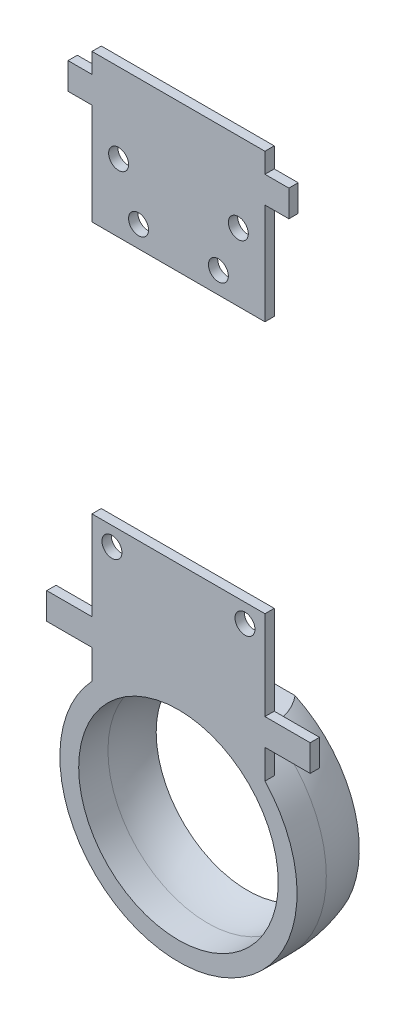
ISO-10303-21;
HEADER;
FILE_DESCRIPTION(('STEP AP214'),'2;1');
FILE_NAME('part.step','',(''),(''),'','','');
FILE_SCHEMA(('AUTOMOTIVE_DESIGN { 1 0 10303 214 1 1 1 1 }'));
ENDSEC;
DATA;
#1=APPLICATION_CONTEXT('core data for automotive mechanical design processes');
#2=APPLICATION_PROTOCOL_DEFINITION('international standard','automotive_design',2000,#1);
#3=PRODUCT_CONTEXT('',#1,'mechanical');
#4=PRODUCT('Part','Part','',(#3));
#5=PRODUCT_RELATED_PRODUCT_CATEGORY('part','',(#4));
#6=PRODUCT_DEFINITION_FORMATION('','',#4);
#7=PRODUCT_DEFINITION_CONTEXT('part definition',#1,'design');
#8=PRODUCT_DEFINITION('design','',#6,#7);
#9=PRODUCT_DEFINITION_SHAPE('','',#8);
#10=(LENGTH_UNIT() NAMED_UNIT(*) SI_UNIT(.MILLI.,.METRE.));
#11=(NAMED_UNIT(*) PLANE_ANGLE_UNIT() SI_UNIT($,.RADIAN.));
#12=(NAMED_UNIT(*) SI_UNIT($,.STERADIAN.) SOLID_ANGLE_UNIT());
#13=UNCERTAINTY_MEASURE_WITH_UNIT(LENGTH_MEASURE(1.E-05),#10,'distance_accuracy_value','');
#14=(GEOMETRIC_REPRESENTATION_CONTEXT(3) GLOBAL_UNCERTAINTY_ASSIGNED_CONTEXT((#13)) GLOBAL_UNIT_ASSIGNED_CONTEXT((#10,
#11,#12)) REPRESENTATION_CONTEXT('',''));
#15=CARTESIAN_POINT('',(0.,0.,0.));
#16=DIRECTION('',(0.,0.,1.));
#17=DIRECTION('',(1.,0.,0.));
#18=AXIS2_PLACEMENT_3D('',#15,#16,#17);
#19=CARTESIAN_POINT('',(0.,0.,0.));
#20=DIRECTION('',(0.,0.,1.));
#21=DIRECTION('',(1.,0.,0.));
#22=AXIS2_PLACEMENT_3D('',#19,#20,#21);
#23=PLANE('',#22);
#24=DIRECTION('',(0.,1.,0.));
#25=VECTOR('',#24,1.);
#26=CARTESIAN_POINT('',(-32.5,0.,0.));
#27=LINE('',#26,#25);
#28=CARTESIAN_POINT('',(-32.5,48.5,0.));
#29=VERTEX_POINT('',#28);
#30=CARTESIAN_POINT('',(-32.5,81.9777538919084,0.));
#31=VERTEX_POINT('',#30);
#32=EDGE_CURVE('E271',#29,#31,#27,.T.);
#33=ORIENTED_EDGE('',*,*,#32,.T.);
#34=DIRECTION('',(1.,0.,0.));
#35=VECTOR('',#34,1.);
#36=CARTESIAN_POINT('',(0.,81.9777538919084,0.));
#37=LINE('',#36,#35);
#38=CARTESIAN_POINT('',(32.5,81.9777538919084,0.));
#39=VERTEX_POINT('',#38);
#40=EDGE_CURVE('E76',#31,#39,#37,.T.);
#41=ORIENTED_EDGE('',*,*,#40,.T.);
#42=DIRECTION('',(0.,1.,0.));
#43=VECTOR('',#42,1.);
#44=CARTESIAN_POINT('',(32.5,0.,0.));
#45=LINE('',#44,#43);
#46=CARTESIAN_POINT('',(32.5,48.5000000000001,0.));
#47=VERTEX_POINT('',#46);
#48=EDGE_CURVE('E173',#47,#39,#45,.T.);
#49=ORIENTED_EDGE('',*,*,#48,.F.);
#50=DIRECTION('',(1.,0.,0.));
#51=VECTOR('',#50,1.);
#52=CARTESIAN_POINT('',(1.58370049100942E-13,48.5000000000002,0.));
#53=LINE('',#52,#51);
#54=CARTESIAN_POINT('',(49.4999999999999,48.5000000000001,0.));
#55=VERTEX_POINT('',#54);
#56=EDGE_CURVE('E246',#47,#55,#53,.T.);
#57=ORIENTED_EDGE('',*,*,#56,.T.);
#58=DIRECTION('',(0.,1.,0.));
#59=VECTOR('',#58,1.);
#60=CARTESIAN_POINT('',(49.4999999999999,0.,0.));
#61=LINE('',#60,#59);
#62=CARTESIAN_POINT('',(49.4999999999999,38.5000000000001,0.));
#63=VERTEX_POINT('',#62);
#64=EDGE_CURVE('E342',#63,#55,#61,.T.);
#65=ORIENTED_EDGE('',*,*,#64,.F.);
#66=DIRECTION('',(1.,0.,0.));
#67=VECTOR('',#66,1.);
#68=CARTESIAN_POINT('',(1.25716430729614E-13,38.5000000000002,0.));
#69=LINE('',#68,#67);
#70=CARTESIAN_POINT('',(32.5,38.5000000000001,0.));
#71=VERTEX_POINT('',#70);
#72=EDGE_CURVE('E337',#71,#63,#69,.T.);
#73=ORIENTED_EDGE('',*,*,#72,.F.);
#74=CARTESIAN_POINT('',(32.5,27.5,0.));
#75=VERTEX_POINT('',#74);
#76=EDGE_CURVE('E302',#75,#71,#45,.T.);
#77=ORIENTED_EDGE('',*,*,#76,.F.);
#78=CARTESIAN_POINT('',(0.,-2.99999999999998,0.));
#79=DIRECTION('',(0.,0.,1.));
#80=DIRECTION('',(1.,0.,0.));
#81=AXIS2_PLACEMENT_3D('',#78,#79,#80);
#82=CIRCLE('',#81,44.5701693961331);
#83=CARTESIAN_POINT('',(23.2916293977043,35.,0.));
#84=VERTEX_POINT('',#83);
#85=EDGE_CURVE('E241',#75,#84,#82,.T.);
#86=ORIENTED_EDGE('',*,*,#85,.T.);
#87=DIRECTION('',(1.,0.,0.));
#88=VECTOR('',#87,1.);
#89=CARTESIAN_POINT('',(-49.5,35.,0.));
#90=LINE('',#89,#88);
#91=CARTESIAN_POINT('',(-23.2916293977042,35.,0.));
#92=VERTEX_POINT('',#91);
#93=EDGE_CURVE('E240',#92,#84,#90,.T.);
#94=ORIENTED_EDGE('',*,*,#93,.F.);
#95=CARTESIAN_POINT('',(-32.5,27.5,0.));
#96=VERTEX_POINT('',#95);
#97=EDGE_CURVE('E245',#92,#96,#82,.T.);
#98=ORIENTED_EDGE('',*,*,#97,.T.);
#99=CARTESIAN_POINT('',(-32.5,38.5,0.));
#100=VERTEX_POINT('',#99);
#101=EDGE_CURVE('E279',#96,#100,#27,.T.);
#102=ORIENTED_EDGE('',*,*,#101,.T.);
#103=DIRECTION('',(-1.,0.,0.));
#104=VECTOR('',#103,1.);
#105=CARTESIAN_POINT('',(0.,38.5,0.));
#106=LINE('',#105,#104);
#107=CARTESIAN_POINT('',(-49.5,38.5,0.));
#108=VERTEX_POINT('',#107);
#109=EDGE_CURVE('E285',#100,#108,#106,.T.);
#110=ORIENTED_EDGE('',*,*,#109,.T.);
#111=DIRECTION('',(0.,1.,0.));
#112=VECTOR('',#111,1.);
#113=CARTESIAN_POINT('',(-49.5,0.,0.));
#114=LINE('',#113,#112);
#115=CARTESIAN_POINT('',(-49.5,48.5,0.));
#116=VERTEX_POINT('',#115);
#117=EDGE_CURVE('E291',#108,#116,#114,.T.);
#118=ORIENTED_EDGE('',*,*,#117,.T.);
#119=DIRECTION('',(-1.,0.,0.));
#120=VECTOR('',#119,1.);
#121=CARTESIAN_POINT('',(0.,48.5,0.));
#122=LINE('',#121,#120);
#123=EDGE_CURVE('E222',#29,#116,#122,.T.);
#124=ORIENTED_EDGE('',*,*,#123,.F.);
#125=EDGE_LOOP('',(#33,#41,#49,#57,#65,#73,#77,#86,#94,#98,#102,#110,#118,#124));
#126=FACE_BOUND('',#125,.T.);
#127=CARTESIAN_POINT('',(-25.,75.,0.));
#128=DIRECTION('',(0.,0.,1.));
#129=DIRECTION('',(1.,0.,0.));
#130=AXIS2_PLACEMENT_3D('',#127,#128,#129);
#131=CIRCLE('',#130,3.75);
#132=CARTESIAN_POINT('',(-21.25,75.,0.));
#133=VERTEX_POINT('',#132);
#134=EDGE_CURVE('E316',#133,#133,#131,.T.);
#135=ORIENTED_EDGE('',*,*,#134,.T.);
#136=EDGE_LOOP('',(#135));
#137=FACE_BOUND('',#136,.T.);
#138=CARTESIAN_POINT('',(25.,75.,0.));
#139=DIRECTION('',(0.,0.,1.));
#140=DIRECTION('',(1.,0.,0.));
#141=AXIS2_PLACEMENT_3D('',#138,#139,#140);
#142=CIRCLE('',#141,3.75);
#143=CARTESIAN_POINT('',(28.75,75.,0.));
#144=VERTEX_POINT('',#143);
#145=EDGE_CURVE('E223',#144,#144,#142,.T.);
#146=ORIENTED_EDGE('',*,*,#145,.T.);
#147=EDGE_LOOP('',(#146));
#148=FACE_BOUND('',#147,.T.);
#149=ADVANCED_FACE('F59',(#126,#137,#148),#23,.F.);
#150=CARTESIAN_POINT('',(-32.5,0.,3.5));
#151=DIRECTION('',(-1.,0.,0.));
#152=DIRECTION('',(0.,0.,1.));
#153=AXIS2_PLACEMENT_3D('',#150,#151,#152);
#154=PLANE('',#153);
#155=DIRECTION('',(0.,0.,1.));
#156=VECTOR('',#155,1.);
#157=CARTESIAN_POINT('',(-32.5,81.9777538919084,3.5));
#158=LINE('',#157,#156);
#159=CARTESIAN_POINT('',(-32.5,81.9777538919084,3.5));
#160=VERTEX_POINT('',#159);
#161=EDGE_CURVE('E68',#31,#160,#158,.T.);
#162=ORIENTED_EDGE('',*,*,#161,.F.);
#163=ORIENTED_EDGE('',*,*,#32,.F.);
#164=DIRECTION('',(0.,0.,-1.));
#165=VECTOR('',#164,1.);
#166=CARTESIAN_POINT('',(-32.5,48.5,3.5));
#167=LINE('',#166,#165);
#168=CARTESIAN_POINT('',(-32.5,48.5,3.5));
#169=VERTEX_POINT('',#168);
#170=EDGE_CURVE('E217',#169,#29,#167,.T.);
#171=ORIENTED_EDGE('',*,*,#170,.F.);
#172=DIRECTION('',(0.,1.,0.));
#173=VECTOR('',#172,1.);
#174=CARTESIAN_POINT('',(-32.5,0.,3.5));
#175=LINE('',#174,#173);
#176=EDGE_CURVE('E219',#169,#160,#175,.T.);
#177=ORIENTED_EDGE('',*,*,#176,.T.);
#178=EDGE_LOOP('',(#162,#163,#171,#177));
#179=FACE_BOUND('',#178,.T.);
#180=ADVANCED_FACE('F387',(#179),#154,.T.);
#181=CARTESIAN_POINT('',(0.,48.5,3.5));
#182=DIRECTION('',(0.,-1.,0.));
#183=DIRECTION('',(0.,0.,-1.));
#184=AXIS2_PLACEMENT_3D('',#181,#182,#183);
#185=PLANE('',#184);
#186=ORIENTED_EDGE('',*,*,#123,.T.);
#187=DIRECTION('',(0.,0.,-1.));
#188=VECTOR('',#187,1.);
#189=CARTESIAN_POINT('',(-49.5,48.5,3.5));
#190=LINE('',#189,#188);
#191=CARTESIAN_POINT('',(-49.5,48.5,3.5));
#192=VERTEX_POINT('',#191);
#193=EDGE_CURVE('E213',#192,#116,#190,.T.);
#194=ORIENTED_EDGE('',*,*,#193,.F.);
#195=DIRECTION('',(-1.,0.,0.));
#196=VECTOR('',#195,1.);
#197=CARTESIAN_POINT('',(0.,48.5,3.5));
#198=LINE('',#197,#196);
#199=EDGE_CURVE('E200',#169,#192,#198,.T.);
#200=ORIENTED_EDGE('',*,*,#199,.F.);
#201=ORIENTED_EDGE('',*,*,#170,.T.);
#202=EDGE_LOOP('',(#186,#194,#200,#201));
#203=FACE_BOUND('',#202,.T.);
#204=ADVANCED_FACE('F391',(#203),#185,.F.);
#205=CARTESIAN_POINT('',(-49.5,0.,3.5));
#206=DIRECTION('',(-1.,0.,0.));
#207=DIRECTION('',(0.,0.,1.));
#208=AXIS2_PLACEMENT_3D('',#205,#206,#207);
#209=PLANE('',#208);
#210=ORIENTED_EDGE('',*,*,#117,.F.);
#211=DIRECTION('',(0.,0.,-1.));
#212=VECTOR('',#211,1.);
#213=CARTESIAN_POINT('',(-49.5,38.5,3.5));
#214=LINE('',#213,#212);
#215=CARTESIAN_POINT('',(-49.5,38.5,3.5));
#216=VERTEX_POINT('',#215);
#217=EDGE_CURVE('E212',#216,#108,#214,.T.);
#218=ORIENTED_EDGE('',*,*,#217,.F.);
#219=DIRECTION('',(0.,1.,0.));
#220=VECTOR('',#219,1.);
#221=CARTESIAN_POINT('',(-49.5,0.,3.5));
#222=LINE('',#221,#220);
#223=EDGE_CURVE('E214',#216,#192,#222,.T.);
#224=ORIENTED_EDGE('',*,*,#223,.T.);
#225=ORIENTED_EDGE('',*,*,#193,.T.);
#226=EDGE_LOOP('',(#210,#218,#224,#225));
#227=FACE_BOUND('',#226,.T.);
#228=ADVANCED_FACE('F397',(#227),#209,.T.);
#229=CARTESIAN_POINT('',(0.,38.5,3.5));
#230=DIRECTION('',(0.,-1.,0.));
#231=DIRECTION('',(0.,0.,-1.));
#232=AXIS2_PLACEMENT_3D('',#229,#230,#231);
#233=PLANE('',#232);
#234=ORIENTED_EDGE('',*,*,#109,.F.);
#235=DIRECTION('',(0.,0.,-1.));
#236=VECTOR('',#235,1.);
#237=CARTESIAN_POINT('',(-32.5,38.5,3.5));
#238=LINE('',#237,#236);
#239=CARTESIAN_POINT('',(-32.5,38.5,3.5));
#240=VERTEX_POINT('',#239);
#241=EDGE_CURVE('E256',#240,#100,#238,.T.);
#242=ORIENTED_EDGE('',*,*,#241,.F.);
#243=DIRECTION('',(-1.,0.,0.));
#244=VECTOR('',#243,1.);
#245=CARTESIAN_POINT('',(0.,38.5,3.5));
#246=LINE('',#245,#244);
#247=EDGE_CURVE('E208',#240,#216,#246,.T.);
#248=ORIENTED_EDGE('',*,*,#247,.T.);
#249=ORIENTED_EDGE('',*,*,#217,.T.);
#250=EDGE_LOOP('',(#234,#242,#248,#249));
#251=FACE_BOUND('',#250,.T.);
#252=ADVANCED_FACE('F310',(#251),#233,.T.);
#253=ORIENTED_EDGE('',*,*,#101,.F.);
#254=DIRECTION('',(0.,0.,-1.));
#255=VECTOR('',#254,1.);
#256=CARTESIAN_POINT('',(-32.5,27.5,3.5));
#257=LINE('',#256,#255);
#258=CARTESIAN_POINT('',(-32.5,27.5,3.5));
#259=VERTEX_POINT('',#258);
#260=EDGE_CURVE('E260',#259,#96,#257,.T.);
#261=ORIENTED_EDGE('',*,*,#260,.F.);
#262=EDGE_CURVE('E224',#259,#240,#175,.T.);
#263=ORIENTED_EDGE('',*,*,#262,.T.);
#264=ORIENTED_EDGE('',*,*,#241,.T.);
#265=EDGE_LOOP('',(#253,#261,#263,#264));
#266=FACE_BOUND('',#265,.T.);
#267=ADVANCED_FACE('F304',(#266),#154,.T.);
#268=CARTESIAN_POINT('',(0.,-2.99999999999996,3.5));
#269=DIRECTION('',(0.,0.,-1.));
#270=DIRECTION('',(-1.,0.,0.));
#271=AXIS2_PLACEMENT_3D('',#268,#269,#270);
#272=CYLINDRICAL_SURFACE('',#271,44.5701693961331);
#273=ORIENTED_EDGE('',*,*,#97,.F.);
#274=DIRECTION('',(0.,0.,-1.));
#275=VECTOR('',#274,1.);
#276=CARTESIAN_POINT('',(-23.2916293977042,35.,3.5));
#277=LINE('',#276,#275);
#278=CARTESIAN_POINT('',(-23.2916293977042,35.,-7.5));
#279=VERTEX_POINT('',#278);
#280=EDGE_CURVE('E252',#92,#279,#277,.T.);
#281=ORIENTED_EDGE('',*,*,#280,.T.);
#282=CARTESIAN_POINT('',(0.,-2.99999999999998,-7.5));
#283=DIRECTION('',(0.,0.,1.));
#284=DIRECTION('',(1.,0.,0.));
#285=AXIS2_PLACEMENT_3D('',#282,#283,#284);
#286=CIRCLE('',#285,44.5701693961331);
#287=CARTESIAN_POINT('',(23.2916293977042,35.,-7.5));
#288=VERTEX_POINT('',#287);
#289=EDGE_CURVE('E247',#279,#288,#286,.T.);
#290=ORIENTED_EDGE('',*,*,#289,.T.);
#291=DIRECTION('',(0.,0.,-1.));
#292=VECTOR('',#291,1.);
#293=CARTESIAN_POINT('',(23.2916293977043,35.,3.5));
#294=LINE('',#293,#292);
#295=EDGE_CURVE('E251',#288,#84,#294,.F.);
#296=ORIENTED_EDGE('',*,*,#295,.T.);
#297=ORIENTED_EDGE('',*,*,#85,.F.);
#298=DIRECTION('',(0.,0.,-1.));
#299=VECTOR('',#298,1.);
#300=CARTESIAN_POINT('',(32.5,27.5,3.5));
#301=LINE('',#300,#299);
#302=CARTESIAN_POINT('',(32.5,27.5,3.5));
#303=VERTEX_POINT('',#302);
#304=EDGE_CURVE('E333',#303,#75,#301,.T.);
#305=ORIENTED_EDGE('',*,*,#304,.F.);
#306=CARTESIAN_POINT('',(0.,-2.99999999999996,3.5));
#307=DIRECTION('',(0.,0.,1.));
#308=DIRECTION('',(1.,0.,0.));
#309=AXIS2_PLACEMENT_3D('',#306,#307,#308);
#310=CIRCLE('',#309,44.5701693961331);
#311=EDGE_CURVE('E195',#259,#303,#310,.T.);
#312=ORIENTED_EDGE('',*,*,#311,.F.);
#313=ORIENTED_EDGE('',*,*,#260,.T.);
#314=EDGE_LOOP('',(#273,#281,#290,#296,#297,#305,#312,#313));
#315=FACE_BOUND('',#314,.T.);
#316=ADVANCED_FACE('F298',(#315),#272,.T.);
#317=CARTESIAN_POINT('',(32.5,0.,3.5));
#318=DIRECTION('',(-1.,0.,0.));
#319=DIRECTION('',(0.,0.,1.));
#320=AXIS2_PLACEMENT_3D('',#317,#318,#319);
#321=PLANE('',#320);
#322=ORIENTED_EDGE('',*,*,#76,.T.);
#323=DIRECTION('',(0.,0.,-1.));
#324=VECTOR('',#323,1.);
#325=CARTESIAN_POINT('',(32.5,38.5000000000001,3.5));
#326=LINE('',#325,#324);
#327=CARTESIAN_POINT('',(32.5,38.5000000000001,3.5));
#328=VERTEX_POINT('',#327);
#329=EDGE_CURVE('E338',#328,#71,#326,.T.);
#330=ORIENTED_EDGE('',*,*,#329,.F.);
#331=DIRECTION('',(0.,1.,0.));
#332=VECTOR('',#331,1.);
#333=CARTESIAN_POINT('',(32.5,0.,3.5));
#334=LINE('',#333,#332);
#335=EDGE_CURVE('E184',#303,#328,#334,.T.);
#336=ORIENTED_EDGE('',*,*,#335,.F.);
#337=ORIENTED_EDGE('',*,*,#304,.T.);
#338=EDGE_LOOP('',(#322,#330,#336,#337));
#339=FACE_BOUND('',#338,.T.);
#340=ADVANCED_FACE('F406',(#339),#321,.F.);
#341=CARTESIAN_POINT('',(1.25716430729614E-13,38.5000000000002,3.5));
#342=DIRECTION('',(0.,1.,0.));
#343=DIRECTION('',(-1.,0.,0.));
#344=AXIS2_PLACEMENT_3D('',#341,#342,#343);
#345=PLANE('',#344);
#346=ORIENTED_EDGE('',*,*,#72,.T.);
#347=DIRECTION('',(0.,0.,-1.));
#348=VECTOR('',#347,1.);
#349=CARTESIAN_POINT('',(49.4999999999999,38.5000000000001,3.5));
#350=LINE('',#349,#348);
#351=CARTESIAN_POINT('',(49.4999999999999,38.5000000000001,3.5));
#352=VERTEX_POINT('',#351);
#353=EDGE_CURVE('E343',#352,#63,#350,.T.);
#354=ORIENTED_EDGE('',*,*,#353,.F.);
#355=DIRECTION('',(1.,0.,0.));
#356=VECTOR('',#355,1.);
#357=CARTESIAN_POINT('',(1.25716430729614E-13,38.5000000000002,3.5));
#358=LINE('',#357,#356);
#359=EDGE_CURVE('E190',#328,#352,#358,.T.);
#360=ORIENTED_EDGE('',*,*,#359,.F.);
#361=ORIENTED_EDGE('',*,*,#329,.T.);
#362=EDGE_LOOP('',(#346,#354,#360,#361));
#363=FACE_BOUND('',#362,.T.);
#364=ADVANCED_FACE('F488',(#363),#345,.F.);
#365=CARTESIAN_POINT('',(49.4999999999999,0.,3.5));
#366=DIRECTION('',(-1.,0.,0.));
#367=DIRECTION('',(0.,-1.,0.));
#368=AXIS2_PLACEMENT_3D('',#365,#366,#367);
#369=PLANE('',#368);
#370=ORIENTED_EDGE('',*,*,#64,.T.);
#371=DIRECTION('',(0.,0.,-1.));
#372=VECTOR('',#371,1.);
#373=CARTESIAN_POINT('',(49.4999999999999,48.5000000000001,3.5));
#374=LINE('',#373,#372);
#375=CARTESIAN_POINT('',(49.4999999999999,48.5000000000001,3.5));
#376=VERTEX_POINT('',#375);
#377=EDGE_CURVE('E347',#376,#55,#374,.T.);
#378=ORIENTED_EDGE('',*,*,#377,.F.);
#379=DIRECTION('',(0.,1.,0.));
#380=VECTOR('',#379,1.);
#381=CARTESIAN_POINT('',(49.4999999999999,0.,3.5));
#382=LINE('',#381,#380);
#383=EDGE_CURVE('E182',#352,#376,#382,.T.);
#384=ORIENTED_EDGE('',*,*,#383,.F.);
#385=ORIENTED_EDGE('',*,*,#353,.T.);
#386=EDGE_LOOP('',(#370,#378,#384,#385));
#387=FACE_BOUND('',#386,.T.);
#388=ADVANCED_FACE('F497',(#387),#369,.F.);
#389=CARTESIAN_POINT('',(1.58370049100942E-13,48.5000000000002,3.5));
#390=DIRECTION('',(0.,1.,0.));
#391=DIRECTION('',(-1.,0.,0.));
#392=AXIS2_PLACEMENT_3D('',#389,#390,#391);
#393=PLANE('',#392);
#394=ORIENTED_EDGE('',*,*,#56,.F.);
#395=DIRECTION('',(0.,0.,-1.));
#396=VECTOR('',#395,1.);
#397=CARTESIAN_POINT('',(32.5,48.5000000000001,3.5));
#398=LINE('',#397,#396);
#399=CARTESIAN_POINT('',(32.5,48.5000000000001,3.5));
#400=VERTEX_POINT('',#399);
#401=EDGE_CURVE('E175',#400,#47,#398,.T.);
#402=ORIENTED_EDGE('',*,*,#401,.F.);
#403=DIRECTION('',(1.,0.,0.));
#404=VECTOR('',#403,1.);
#405=CARTESIAN_POINT('',(1.58370049100942E-13,48.5000000000002,3.5));
#406=LINE('',#405,#404);
#407=EDGE_CURVE('E179',#400,#376,#406,.T.);
#408=ORIENTED_EDGE('',*,*,#407,.T.);
#409=ORIENTED_EDGE('',*,*,#377,.T.);
#410=EDGE_LOOP('',(#394,#402,#408,#409));
#411=FACE_BOUND('',#410,.T.);
#412=ADVANCED_FACE('F506',(#411),#393,.T.);
#413=ORIENTED_EDGE('',*,*,#48,.T.);
#414=DIRECTION('',(0.,0.,1.));
#415=VECTOR('',#414,1.);
#416=CARTESIAN_POINT('',(32.5,81.9777538919084,3.5));
#417=LINE('',#416,#415);
#418=CARTESIAN_POINT('',(32.5,81.9777538919084,3.5));
#419=VERTEX_POINT('',#418);
#420=EDGE_CURVE('E161',#39,#419,#417,.T.);
#421=ORIENTED_EDGE('',*,*,#420,.T.);
#422=EDGE_CURVE('E170',#400,#419,#334,.T.);
#423=ORIENTED_EDGE('',*,*,#422,.F.);
#424=ORIENTED_EDGE('',*,*,#401,.T.);
#425=EDGE_LOOP('',(#413,#421,#423,#424));
#426=FACE_BOUND('',#425,.T.);
#427=ADVANCED_FACE('F169',(#426),#321,.F.);
#428=CARTESIAN_POINT('',(-25.,75.,3.5));
#429=DIRECTION('',(0.,0.,-1.));
#430=DIRECTION('',(-1.,0.,0.));
#431=AXIS2_PLACEMENT_3D('',#428,#429,#430);
#432=CYLINDRICAL_SURFACE('',#431,3.75);
#433=CARTESIAN_POINT('',(-25.,75.,3.5));
#434=DIRECTION('',(0.,0.,1.));
#435=DIRECTION('',(1.,0.,0.));
#436=AXIS2_PLACEMENT_3D('',#433,#434,#435);
#437=CIRCLE('',#436,3.75);
#438=CARTESIAN_POINT('',(-21.25,75.,3.5));
#439=VERTEX_POINT('',#438);
#440=EDGE_CURVE('E225',#439,#439,#437,.T.);
#441=ORIENTED_EDGE('',*,*,#440,.T.);
#442=EDGE_LOOP('',(#441));
#443=FACE_BOUND('',#442,.T.);
#444=ORIENTED_EDGE('',*,*,#134,.F.);
#445=EDGE_LOOP('',(#444));
#446=FACE_BOUND('',#445,.T.);
#447=ADVANCED_FACE('F375',(#443,#446),#432,.F.);
#448=CARTESIAN_POINT('',(25.,75.,3.5));
#449=DIRECTION('',(0.,0.,-1.));
#450=DIRECTION('',(-1.,0.,0.));
#451=AXIS2_PLACEMENT_3D('',#448,#449,#450);
#452=CYLINDRICAL_SURFACE('',#451,3.75);
#453=CARTESIAN_POINT('',(25.,75.,3.5));
#454=DIRECTION('',(0.,0.,1.));
#455=DIRECTION('',(1.,0.,0.));
#456=AXIS2_PLACEMENT_3D('',#453,#454,#455);
#457=CIRCLE('',#456,3.75);
#458=CARTESIAN_POINT('',(28.75,75.,3.5));
#459=VERTEX_POINT('',#458);
#460=EDGE_CURVE('E229',#459,#459,#457,.T.);
#461=ORIENTED_EDGE('',*,*,#460,.T.);
#462=EDGE_LOOP('',(#461));
#463=FACE_BOUND('',#462,.T.);
#464=ORIENTED_EDGE('',*,*,#145,.F.);
#465=EDGE_LOOP('',(#464));
#466=FACE_BOUND('',#465,.T.);
#467=ADVANCED_FACE('F372',(#463,#466),#452,.F.);
#468=CARTESIAN_POINT('',(0.,-2.99999999999996,3.5));
#469=DIRECTION('',(0.,0.,-1.));
#470=DIRECTION('',(-1.,0.,0.));
#471=AXIS2_PLACEMENT_3D('',#468,#469,#470);
#472=CYLINDRICAL_SURFACE('',#471,37.5);
#473=CARTESIAN_POINT('',(0.,-2.99999999999996,3.5));
#474=DIRECTION('',(0.,0.,1.));
#475=DIRECTION('',(1.,0.,0.));
#476=AXIS2_PLACEMENT_3D('',#473,#474,#475);
#477=CIRCLE('',#476,37.5);
#478=CARTESIAN_POINT('',(37.5,-2.99999999999996,3.5));
#479=VERTEX_POINT('',#478);
#480=EDGE_CURVE('E205',#479,#479,#477,.T.);
#481=ORIENTED_EDGE('',*,*,#480,.T.);
#482=EDGE_LOOP('',(#481));
#483=FACE_BOUND('',#482,.T.);
#484=CARTESIAN_POINT('',(0.,-2.99999999999998,-7.5));
#485=DIRECTION('',(0.,0.,1.));
#486=DIRECTION('',(1.,0.,0.));
#487=AXIS2_PLACEMENT_3D('',#484,#485,#486);
#488=CIRCLE('',#487,37.5);
#489=CARTESIAN_POINT('',(37.5,-2.99999999999998,-7.5));
#490=VERTEX_POINT('',#489);
#491=EDGE_CURVE('E181',#490,#490,#488,.T.);
#492=ORIENTED_EDGE('',*,*,#491,.F.);
#493=EDGE_LOOP('',(#492));
#494=FACE_BOUND('',#493,.T.);
#495=ADVANCED_FACE('F374',(#483,#494),#472,.F.);
#496=CARTESIAN_POINT('',(0.,0.,3.5));
#497=DIRECTION('',(0.,0.,1.));
#498=DIRECTION('',(1.,0.,0.));
#499=AXIS2_PLACEMENT_3D('',#496,#497,#498);
#500=PLANE('',#499);
#501=DIRECTION('',(1.,0.,0.));
#502=VECTOR('',#501,1.);
#503=CARTESIAN_POINT('',(55.0959171218973,81.9777538919084,3.5));
#504=LINE('',#503,#502);
#505=EDGE_CURVE('E12',#160,#419,#504,.T.);
#506=ORIENTED_EDGE('',*,*,#505,.F.);
#507=ORIENTED_EDGE('',*,*,#176,.F.);
#508=ORIENTED_EDGE('',*,*,#199,.T.);
#509=ORIENTED_EDGE('',*,*,#223,.F.);
#510=ORIENTED_EDGE('',*,*,#247,.F.);
#511=ORIENTED_EDGE('',*,*,#262,.F.);
#512=ORIENTED_EDGE('',*,*,#311,.T.);
#513=ORIENTED_EDGE('',*,*,#335,.T.);
#514=ORIENTED_EDGE('',*,*,#359,.T.);
#515=ORIENTED_EDGE('',*,*,#383,.T.);
#516=ORIENTED_EDGE('',*,*,#407,.F.);
#517=ORIENTED_EDGE('',*,*,#422,.T.);
#518=EDGE_LOOP('',(#506,#507,#508,#509,#510,#511,#512,#513,#514,#515,#516,#517));
#519=FACE_BOUND('',#518,.T.);
#520=ORIENTED_EDGE('',*,*,#460,.F.);
#521=EDGE_LOOP('',(#520));
#522=FACE_BOUND('',#521,.T.);
#523=ORIENTED_EDGE('',*,*,#440,.F.);
#524=EDGE_LOOP('',(#523));
#525=FACE_BOUND('',#524,.T.);
#526=ORIENTED_EDGE('',*,*,#480,.F.);
#527=EDGE_LOOP('',(#526));
#528=FACE_BOUND('',#527,.T.);
#529=ADVANCED_FACE('F176',(#519,#522,#525,#528),#500,.T.);
#530=CARTESIAN_POINT('',(0.,-2.99999999999998,-7.5));
#531=DIRECTION('',(0.,0.,1.));
#532=DIRECTION('',(0.,1.,0.));
#533=AXIS2_PLACEMENT_3D('',#530,#531,#532);
#534=SPHERICAL_SURFACE('',#533,37.5);
#535=CARTESIAN_POINT('',(0.,-2.99999999999998,-22.5));
#536=DIRECTION('',(0.,0.,1.));
#537=DIRECTION('',(1.,0.,0.));
#538=AXIS2_PLACEMENT_3D('',#535,#536,#537);
#539=CIRCLE('',#538,34.3693177121688);
#540=CARTESIAN_POINT('',(34.3693177121688,-2.99999999999998,-22.5));
#541=VERTEX_POINT('',#540);
#542=EDGE_CURVE('E188',#541,#541,#539,.T.);
#543=ORIENTED_EDGE('',*,*,#542,.F.);
#544=EDGE_LOOP('',(#543));
#545=FACE_BOUND('',#544,.T.);
#546=ORIENTED_EDGE('',*,*,#491,.T.);
#547=EDGE_LOOP('',(#546));
#548=FACE_BOUND('',#547,.T.);
#549=ADVANCED_FACE('F545',(#545,#548),#534,.F.);
#550=CARTESIAN_POINT('',(0.,0.,-22.5));
#551=DIRECTION('',(0.,0.,-1.));
#552=DIRECTION('',(-1.,0.,0.));
#553=AXIS2_PLACEMENT_3D('',#550,#551,#552);
#554=PLANE('',#553);
#555=DIRECTION('',(-1.,0.,0.));
#556=VECTOR('',#555,1.);
#557=CARTESIAN_POINT('',(0.,35.,-22.5));
#558=LINE('',#557,#556);
#559=CARTESIAN_POINT('',(17.8185296812054,35.,-22.5));
#560=VERTEX_POINT('',#559);
#561=CARTESIAN_POINT('',(-17.8185296812054,35.,-22.5));
#562=VERTEX_POINT('',#561);
#563=EDGE_CURVE('E261',#560,#562,#558,.T.);
#564=ORIENTED_EDGE('',*,*,#563,.F.);
#565=CARTESIAN_POINT('',(0.,-2.99999999999998,-22.5));
#566=DIRECTION('',(0.,0.,1.));
#567=DIRECTION('',(1.,0.,0.));
#568=AXIS2_PLACEMENT_3D('',#565,#566,#567);
#569=CIRCLE('',#568,41.9702275428666);
#570=EDGE_CURVE('E236',#562,#560,#569,.T.);
#571=ORIENTED_EDGE('',*,*,#570,.F.);
#572=EDGE_LOOP('',(#564,#571));
#573=FACE_BOUND('',#572,.T.);
#574=ORIENTED_EDGE('',*,*,#542,.T.);
#575=EDGE_LOOP('',(#574));
#576=FACE_BOUND('',#575,.T.);
#577=ADVANCED_FACE('F553',(#573,#576),#554,.T.);
#578=CARTESIAN_POINT('',(0.,-2.99999999999998,-7.5));
#579=DIRECTION('',(0.,0.,1.));
#580=DIRECTION('',(0.,-1.,0.));
#581=AXIS2_PLACEMENT_3D('',#578,#579,#580);
#582=SPHERICAL_SURFACE('',#581,44.5701693961331);
#583=CARTESIAN_POINT('',(0.,35.,-7.5));
#584=DIRECTION('',(0.,-1.,0.));
#585=DIRECTION('',(0.,0.,-1.));
#586=AXIS2_PLACEMENT_3D('',#583,#584,#585);
#587=CIRCLE('',#586,23.2916293977042);
#588=EDGE_CURVE('E264',#562,#279,#587,.F.);
#589=ORIENTED_EDGE('',*,*,#588,.F.);
#590=ORIENTED_EDGE('',*,*,#570,.T.);
#591=EDGE_CURVE('E265',#288,#560,#587,.F.);
#592=ORIENTED_EDGE('',*,*,#591,.F.);
#593=ORIENTED_EDGE('',*,*,#289,.F.);
#594=EDGE_LOOP('',(#589,#590,#592,#593));
#595=FACE_BOUND('',#594,.T.);
#596=ADVANCED_FACE('F562',(#595),#582,.T.);
#597=CARTESIAN_POINT('',(-49.5,35.,0.));
#598=DIRECTION('',(0.,-1.,0.));
#599=DIRECTION('',(0.,0.,-1.));
#600=AXIS2_PLACEMENT_3D('',#597,#598,#599);
#601=PLANE('',#600);
#602=ORIENTED_EDGE('',*,*,#93,.T.);
#603=ORIENTED_EDGE('',*,*,#295,.F.);
#604=ORIENTED_EDGE('',*,*,#591,.T.);
#605=ORIENTED_EDGE('',*,*,#563,.T.);
#606=ORIENTED_EDGE('',*,*,#588,.T.);
#607=ORIENTED_EDGE('',*,*,#280,.F.);
#608=EDGE_LOOP('',(#602,#603,#604,#605,#606,#607));
#609=FACE_BOUND('',#608,.T.);
#610=ADVANCED_FACE('F571',(#609),#601,.F.);
#611=CARTESIAN_POINT('',(55.0959171218973,81.9777538919084,-46.5));
#612=DIRECTION('',(0.,-1.,0.));
#613=DIRECTION('',(1.,0.,0.));
#614=AXIS2_PLACEMENT_3D('',#611,#612,#613);
#615=PLANE('',#614);
#616=ORIENTED_EDGE('',*,*,#161,.T.);
#617=ORIENTED_EDGE('',*,*,#505,.T.);
#618=ORIENTED_EDGE('',*,*,#420,.F.);
#619=ORIENTED_EDGE('',*,*,#40,.F.);
#620=EDGE_LOOP('',(#616,#617,#618,#619));
#621=FACE_BOUND('',#620,.T.);
#622=ADVANCED_FACE('F160',(#621),#615,.F.);
#623=CLOSED_SHELL('',(#149,#180,#204,#228,#252,#267,#316,#340,#364,#388,#412,#427,#447,#467,
#495,#529,#549,#577,#596,#610,#622));
#624=MANIFOLD_SOLID_BREP('B2',#623);
#625=CARTESIAN_POINT('',(-15.,185.,3.5));
#626=DIRECTION('',(0.,0.,-1.));
#627=DIRECTION('',(-1.,0.,0.));
#628=AXIS2_PLACEMENT_3D('',#625,#626,#627);
#629=CYLINDRICAL_SURFACE('',#628,3.75);
#630=CARTESIAN_POINT('',(-15.,185.,3.5));
#631=DIRECTION('',(0.,0.,1.));
#632=DIRECTION('',(1.,0.,0.));
#633=AXIS2_PLACEMENT_3D('',#630,#631,#632);
#634=CIRCLE('',#633,3.75);
#635=CARTESIAN_POINT('',(-11.25,185.,3.5));
#636=VERTEX_POINT('',#635);
#637=EDGE_CURVE('E839',#636,#636,#634,.T.);
#638=ORIENTED_EDGE('',*,*,#637,.T.);
#639=EDGE_LOOP('',(#638));
#640=FACE_BOUND('',#639,.T.);
#641=CARTESIAN_POINT('',(-15.,185.,0.));
#642=DIRECTION('',(0.,0.,1.));
#643=DIRECTION('',(1.,0.,0.));
#644=AXIS2_PLACEMENT_3D('',#641,#642,#643);
#645=CIRCLE('',#644,3.75);
#646=CARTESIAN_POINT('',(-11.25,185.,0.));
#647=VERTEX_POINT('',#646);
#648=EDGE_CURVE('E802',#647,#647,#645,.T.);
#649=ORIENTED_EDGE('',*,*,#648,.F.);
#650=EDGE_LOOP('',(#649));
#651=FACE_BOUND('',#650,.T.);
#652=ADVANCED_FACE('F675',(#640,#651),#629,.F.);
#653=CARTESIAN_POINT('',(15.,185.,3.5));
#654=DIRECTION('',(0.,0.,-1.));
#655=DIRECTION('',(-1.,0.,0.));
#656=AXIS2_PLACEMENT_3D('',#653,#654,#655);
#657=CYLINDRICAL_SURFACE('',#656,3.75);
#658=CARTESIAN_POINT('',(15.,185.,3.5));
#659=DIRECTION('',(0.,0.,1.));
#660=DIRECTION('',(1.,0.,0.));
#661=AXIS2_PLACEMENT_3D('',#658,#659,#660);
#662=CIRCLE('',#661,3.75);
#663=CARTESIAN_POINT('',(18.75,185.,3.5));
#664=VERTEX_POINT('',#663);
#665=EDGE_CURVE('E905',#664,#664,#662,.T.);
#666=ORIENTED_EDGE('',*,*,#665,.T.);
#667=EDGE_LOOP('',(#666));
#668=FACE_BOUND('',#667,.T.);
#669=CARTESIAN_POINT('',(15.,185.,0.));
#670=DIRECTION('',(0.,0.,1.));
#671=DIRECTION('',(1.,0.,0.));
#672=AXIS2_PLACEMENT_3D('',#669,#670,#671);
#673=CIRCLE('',#672,3.75);
#674=CARTESIAN_POINT('',(18.75,185.,0.));
#675=VERTEX_POINT('',#674);
#676=EDGE_CURVE('E805',#675,#675,#673,.T.);
#677=ORIENTED_EDGE('',*,*,#676,.F.);
#678=EDGE_LOOP('',(#677));
#679=FACE_BOUND('',#678,.T.);
#680=ADVANCED_FACE('F932',(#668,#679),#657,.F.);
#681=CARTESIAN_POINT('',(22.5,202.5,3.5));
#682=DIRECTION('',(0.,0.,-1.));
#683=DIRECTION('',(-1.,0.,0.));
#684=AXIS2_PLACEMENT_3D('',#681,#682,#683);
#685=CYLINDRICAL_SURFACE('',#684,3.75);
#686=CARTESIAN_POINT('',(22.5,202.5,3.5));
#687=DIRECTION('',(0.,0.,1.));
#688=DIRECTION('',(1.,0.,0.));
#689=AXIS2_PLACEMENT_3D('',#686,#687,#688);
#690=CIRCLE('',#689,3.75);
#691=CARTESIAN_POINT('',(26.25,202.5,3.5));
#692=VERTEX_POINT('',#691);
#693=EDGE_CURVE('E908',#692,#692,#690,.T.);
#694=ORIENTED_EDGE('',*,*,#693,.T.);
#695=EDGE_LOOP('',(#694));
#696=FACE_BOUND('',#695,.T.);
#697=CARTESIAN_POINT('',(22.5,202.5,0.));
#698=DIRECTION('',(0.,0.,1.));
#699=DIRECTION('',(1.,0.,0.));
#700=AXIS2_PLACEMENT_3D('',#697,#698,#699);
#701=CIRCLE('',#700,3.75);
#702=CARTESIAN_POINT('',(26.25,202.5,0.));
#703=VERTEX_POINT('',#702);
#704=EDGE_CURVE('E808',#703,#703,#701,.T.);
#705=ORIENTED_EDGE('',*,*,#704,.F.);
#706=EDGE_LOOP('',(#705));
#707=FACE_BOUND('',#706,.T.);
#708=ADVANCED_FACE('F944',(#696,#707),#685,.F.);
#709=CARTESIAN_POINT('',(-22.5,202.5,3.5));
#710=DIRECTION('',(0.,0.,-1.));
#711=DIRECTION('',(-1.,0.,0.));
#712=AXIS2_PLACEMENT_3D('',#709,#710,#711);
#713=CYLINDRICAL_SURFACE('',#712,3.75);
#714=CARTESIAN_POINT('',(-22.5,202.5,3.5));
#715=DIRECTION('',(0.,0.,1.));
#716=DIRECTION('',(1.,0.,0.));
#717=AXIS2_PLACEMENT_3D('',#714,#715,#716);
#718=CIRCLE('',#717,3.75);
#719=CARTESIAN_POINT('',(-18.75,202.5,3.5));
#720=VERTEX_POINT('',#719);
#721=EDGE_CURVE('E911',#720,#720,#718,.T.);
#722=ORIENTED_EDGE('',*,*,#721,.T.);
#723=EDGE_LOOP('',(#722));
#724=FACE_BOUND('',#723,.T.);
#725=CARTESIAN_POINT('',(-22.5,202.5,0.));
#726=DIRECTION('',(0.,0.,1.));
#727=DIRECTION('',(1.,0.,0.));
#728=AXIS2_PLACEMENT_3D('',#725,#726,#727);
#729=CIRCLE('',#728,3.75);
#730=CARTESIAN_POINT('',(-18.75,202.5,0.));
#731=VERTEX_POINT('',#730);
#732=EDGE_CURVE('E811',#731,#731,#729,.T.);
#733=ORIENTED_EDGE('',*,*,#732,.F.);
#734=EDGE_LOOP('',(#733));
#735=FACE_BOUND('',#734,.T.);
#736=ADVANCED_FACE('F918',(#724,#735),#713,.F.);
#737=CARTESIAN_POINT('',(0.,215.,3.5));
#738=DIRECTION('',(0.,-1.,0.));
#739=DIRECTION('',(0.,0.,-1.));
#740=AXIS2_PLACEMENT_3D('',#737,#738,#739);
#741=PLANE('',#740);
#742=DIRECTION('',(-1.,0.,0.));
#743=VECTOR('',#742,1.);
#744=CARTESIAN_POINT('',(0.,215.,0.));
#745=LINE('',#744,#743);
#746=CARTESIAN_POINT('',(-32.5,215.,0.));
#747=VERTEX_POINT('',#746);
#748=CARTESIAN_POINT('',(-41.5,215.,0.));
#749=VERTEX_POINT('',#748);
#750=EDGE_CURVE('E836',#747,#749,#745,.T.);
#751=ORIENTED_EDGE('',*,*,#750,.F.);
#752=DIRECTION('',(0.,0.,-1.));
#753=VECTOR('',#752,1.);
#754=CARTESIAN_POINT('',(-32.5,215.,3.5));
#755=LINE('',#754,#753);
#756=CARTESIAN_POINT('',(-32.5,215.,3.5));
#757=VERTEX_POINT('',#756);
#758=EDGE_CURVE('E801',#757,#747,#755,.T.);
#759=ORIENTED_EDGE('',*,*,#758,.F.);
#760=DIRECTION('',(-1.,0.,0.));
#761=VECTOR('',#760,1.);
#762=CARTESIAN_POINT('',(0.,215.,3.5));
#763=LINE('',#762,#761);
#764=CARTESIAN_POINT('',(-41.5,215.,3.5));
#765=VERTEX_POINT('',#764);
#766=EDGE_CURVE('E795',#757,#765,#763,.T.);
#767=ORIENTED_EDGE('',*,*,#766,.T.);
#768=DIRECTION('',(0.,0.,-1.));
#769=VECTOR('',#768,1.);
#770=CARTESIAN_POINT('',(-41.5,215.,3.5));
#771=LINE('',#770,#769);
#772=EDGE_CURVE('E791',#765,#749,#771,.T.);
#773=ORIENTED_EDGE('',*,*,#772,.T.);
#774=EDGE_LOOP('',(#751,#759,#767,#773));
#775=FACE_BOUND('',#774,.T.);
#776=ADVANCED_FACE('F888',(#775),#741,.T.);
#777=CARTESIAN_POINT('',(-41.5,0.,3.5));
#778=DIRECTION('',(1.,0.,0.));
#779=DIRECTION('',(0.,0.,-1.));
#780=AXIS2_PLACEMENT_3D('',#777,#778,#779);
#781=PLANE('',#780);
#782=DIRECTION('',(0.,-1.,0.));
#783=VECTOR('',#782,1.);
#784=CARTESIAN_POINT('',(-41.5,0.,0.));
#785=LINE('',#784,#783);
#786=CARTESIAN_POINT('',(-41.5,225.,0.));
#787=VERTEX_POINT('',#786);
#788=EDGE_CURVE('E834',#787,#749,#785,.T.);
#789=ORIENTED_EDGE('',*,*,#788,.T.);
#790=ORIENTED_EDGE('',*,*,#772,.F.);
#791=DIRECTION('',(0.,-1.,0.));
#792=VECTOR('',#791,1.);
#793=CARTESIAN_POINT('',(-41.5,0.,3.5));
#794=LINE('',#793,#792);
#795=CARTESIAN_POINT('',(-41.5,225.,3.5));
#796=VERTEX_POINT('',#795);
#797=EDGE_CURVE('E775',#796,#765,#794,.T.);
#798=ORIENTED_EDGE('',*,*,#797,.F.);
#799=DIRECTION('',(0.,0.,-1.));
#800=VECTOR('',#799,1.);
#801=CARTESIAN_POINT('',(-41.5,225.,3.5));
#802=LINE('',#801,#800);
#803=EDGE_CURVE('E783',#796,#787,#802,.T.);
#804=ORIENTED_EDGE('',*,*,#803,.T.);
#805=EDGE_LOOP('',(#789,#790,#798,#804));
#806=FACE_BOUND('',#805,.T.);
#807=ADVANCED_FACE('F793',(#806),#781,.F.);
#808=CARTESIAN_POINT('',(0.,225.,3.5));
#809=DIRECTION('',(0.,-1.,0.));
#810=DIRECTION('',(0.,0.,-1.));
#811=AXIS2_PLACEMENT_3D('',#808,#809,#810);
#812=PLANE('',#811);
#813=DIRECTION('',(-1.,0.,0.));
#814=VECTOR('',#813,1.);
#815=CARTESIAN_POINT('',(0.,225.,0.));
#816=LINE('',#815,#814);
#817=CARTESIAN_POINT('',(-32.5,225.,0.));
#818=VERTEX_POINT('',#817);
#819=EDGE_CURVE('E786',#818,#787,#816,.T.);
#820=ORIENTED_EDGE('',*,*,#819,.T.);
#821=ORIENTED_EDGE('',*,*,#803,.F.);
#822=DIRECTION('',(-1.,0.,0.));
#823=VECTOR('',#822,1.);
#824=CARTESIAN_POINT('',(0.,225.,3.5));
#825=LINE('',#824,#823);
#826=CARTESIAN_POINT('',(-32.5,225.,3.5));
#827=VERTEX_POINT('',#826);
#828=EDGE_CURVE('E769',#827,#796,#825,.T.);
#829=ORIENTED_EDGE('',*,*,#828,.F.);
#830=DIRECTION('',(0.,0.,-1.));
#831=VECTOR('',#830,1.);
#832=CARTESIAN_POINT('',(-32.5,225.,3.5));
#833=LINE('',#832,#831);
#834=EDGE_CURVE('E790',#827,#818,#833,.T.);
#835=ORIENTED_EDGE('',*,*,#834,.T.);
#836=EDGE_LOOP('',(#820,#821,#829,#835));
#837=FACE_BOUND('',#836,.T.);
#838=ADVANCED_FACE('F784',(#837),#812,.F.);
#839=CARTESIAN_POINT('',(-32.5,0.,3.5));
#840=DIRECTION('',(-1.,0.,0.));
#841=DIRECTION('',(0.,0.,1.));
#842=AXIS2_PLACEMENT_3D('',#839,#840,#841);
#843=PLANE('',#842);
#844=DIRECTION('',(0.,1.,0.));
#845=VECTOR('',#844,1.);
#846=CARTESIAN_POINT('',(-32.5,0.,0.));
#847=LINE('',#846,#845);
#848=CARTESIAN_POINT('',(-32.5,232.5,0.));
#849=VERTEX_POINT('',#848);
#850=EDGE_CURVE('E830',#818,#849,#847,.T.);
#851=ORIENTED_EDGE('',*,*,#850,.F.);
#852=ORIENTED_EDGE('',*,*,#834,.F.);
#853=DIRECTION('',(0.,1.,0.));
#854=VECTOR('',#853,1.);
#855=CARTESIAN_POINT('',(-32.5,0.,3.5));
#856=LINE('',#855,#854);
#857=CARTESIAN_POINT('',(-32.5,232.5,3.5));
#858=VERTEX_POINT('',#857);
#859=EDGE_CURVE('E779',#827,#858,#856,.T.);
#860=ORIENTED_EDGE('',*,*,#859,.T.);
#861=DIRECTION('',(0.,0.,-1.));
#862=VECTOR('',#861,1.);
#863=CARTESIAN_POINT('',(-32.5,232.5,3.5));
#864=LINE('',#863,#862);
#865=EDGE_CURVE('E843',#858,#849,#864,.T.);
#866=ORIENTED_EDGE('',*,*,#865,.T.);
#867=EDGE_LOOP('',(#851,#852,#860,#866));
#868=FACE_BOUND('',#867,.T.);
#869=ADVANCED_FACE('F884',(#868),#843,.T.);
#870=CARTESIAN_POINT('',(0.,232.5,3.5));
#871=DIRECTION('',(0.,1.,0.));
#872=DIRECTION('',(0.,0.,1.));
#873=AXIS2_PLACEMENT_3D('',#870,#871,#872);
#874=PLANE('',#873);
#875=DIRECTION('',(1.,0.,0.));
#876=VECTOR('',#875,1.);
#877=CARTESIAN_POINT('',(0.,232.5,0.));
#878=LINE('',#877,#876);
#879=CARTESIAN_POINT('',(32.5,232.5,0.));
#880=VERTEX_POINT('',#879);
#881=EDGE_CURVE('E827',#849,#880,#878,.T.);
#882=ORIENTED_EDGE('',*,*,#881,.F.);
#883=ORIENTED_EDGE('',*,*,#865,.F.);
#884=DIRECTION('',(1.,0.,0.));
#885=VECTOR('',#884,1.);
#886=CARTESIAN_POINT('',(0.,232.5,3.5));
#887=LINE('',#886,#885);
#888=CARTESIAN_POINT('',(32.5,232.5,3.5));
#889=VERTEX_POINT('',#888);
#890=EDGE_CURVE('E876',#858,#889,#887,.T.);
#891=ORIENTED_EDGE('',*,*,#890,.T.);
#892=DIRECTION('',(0.,0.,-1.));
#893=VECTOR('',#892,1.);
#894=CARTESIAN_POINT('',(32.5,232.5,3.5));
#895=LINE('',#894,#893);
#896=EDGE_CURVE('E845',#889,#880,#895,.T.);
#897=ORIENTED_EDGE('',*,*,#896,.T.);
#898=EDGE_LOOP('',(#882,#883,#891,#897));
#899=FACE_BOUND('',#898,.T.);
#900=ADVANCED_FACE('F1074',(#899),#874,.T.);
#901=CARTESIAN_POINT('',(32.5,0.,3.5));
#902=DIRECTION('',(-1.,0.,0.));
#903=DIRECTION('',(0.,0.,1.));
#904=AXIS2_PLACEMENT_3D('',#901,#902,#903);
#905=PLANE('',#904);
#906=DIRECTION('',(0.,1.,0.));
#907=VECTOR('',#906,1.);
#908=CARTESIAN_POINT('',(32.5,0.,0.));
#909=LINE('',#908,#907);
#910=CARTESIAN_POINT('',(32.5,225.,0.));
#911=VERTEX_POINT('',#910);
#912=EDGE_CURVE('E824',#911,#880,#909,.T.);
#913=ORIENTED_EDGE('',*,*,#912,.T.);
#914=ORIENTED_EDGE('',*,*,#896,.F.);
#915=DIRECTION('',(0.,1.,0.));
#916=VECTOR('',#915,1.);
#917=CARTESIAN_POINT('',(32.5,0.,3.5));
#918=LINE('',#917,#916);
#919=CARTESIAN_POINT('',(32.5,225.,3.5));
#920=VERTEX_POINT('',#919);
#921=EDGE_CURVE('E874',#920,#889,#918,.T.);
#922=ORIENTED_EDGE('',*,*,#921,.F.);
#923=DIRECTION('',(0.,0.,-1.));
#924=VECTOR('',#923,1.);
#925=CARTESIAN_POINT('',(32.5,225.,3.5));
#926=LINE('',#925,#924);
#927=EDGE_CURVE('E847',#920,#911,#926,.T.);
#928=ORIENTED_EDGE('',*,*,#927,.T.);
#929=EDGE_LOOP('',(#913,#914,#922,#928));
#930=FACE_BOUND('',#929,.T.);
#931=ADVANCED_FACE('F872',(#930),#905,.F.);
#932=CARTESIAN_POINT('',(0.,225.,3.5));
#933=DIRECTION('',(0.,-1.,0.));
#934=DIRECTION('',(0.,0.,-1.));
#935=AXIS2_PLACEMENT_3D('',#932,#933,#934);
#936=PLANE('',#935);
#937=DIRECTION('',(-1.,0.,0.));
#938=VECTOR('',#937,1.);
#939=CARTESIAN_POINT('',(0.,225.,0.));
#940=LINE('',#939,#938);
#941=CARTESIAN_POINT('',(41.5,225.,0.));
#942=VERTEX_POINT('',#941);
#943=EDGE_CURVE('E822',#942,#911,#940,.T.);
#944=ORIENTED_EDGE('',*,*,#943,.T.);
#945=ORIENTED_EDGE('',*,*,#927,.F.);
#946=DIRECTION('',(-1.,0.,0.));
#947=VECTOR('',#946,1.);
#948=CARTESIAN_POINT('',(0.,225.,3.5));
#949=LINE('',#948,#947);
#950=CARTESIAN_POINT('',(41.5,225.,3.5));
#951=VERTEX_POINT('',#950);
#952=EDGE_CURVE('E877',#951,#920,#949,.T.);
#953=ORIENTED_EDGE('',*,*,#952,.F.);
#954=DIRECTION('',(0.,0.,-1.));
#955=VECTOR('',#954,1.);
#956=CARTESIAN_POINT('',(41.5,225.,3.5));
#957=LINE('',#956,#955);
#958=EDGE_CURVE('E850',#951,#942,#957,.T.);
#959=ORIENTED_EDGE('',*,*,#958,.T.);
#960=EDGE_LOOP('',(#944,#945,#953,#959));
#961=FACE_BOUND('',#960,.T.);
#962=ADVANCED_FACE('F868',(#961),#936,.F.);
#963=CARTESIAN_POINT('',(41.5,0.,3.5));
#964=DIRECTION('',(1.,0.,0.));
#965=DIRECTION('',(0.,0.,-1.));
#966=AXIS2_PLACEMENT_3D('',#963,#964,#965);
#967=PLANE('',#966);
#968=DIRECTION('',(0.,-1.,0.));
#969=VECTOR('',#968,1.);
#970=CARTESIAN_POINT('',(41.5,0.,0.));
#971=LINE('',#970,#969);
#972=CARTESIAN_POINT('',(41.5,215.,0.));
#973=VERTEX_POINT('',#972);
#974=EDGE_CURVE('E819',#942,#973,#971,.T.);
#975=ORIENTED_EDGE('',*,*,#974,.F.);
#976=ORIENTED_EDGE('',*,*,#958,.F.);
#977=DIRECTION('',(0.,-1.,0.));
#978=VECTOR('',#977,1.);
#979=CARTESIAN_POINT('',(41.5,0.,3.5));
#980=LINE('',#979,#978);
#981=CARTESIAN_POINT('',(41.5,215.,3.5));
#982=VERTEX_POINT('',#981);
#983=EDGE_CURVE('E857',#951,#982,#980,.T.);
#984=ORIENTED_EDGE('',*,*,#983,.T.);
#985=DIRECTION('',(0.,0.,-1.));
#986=VECTOR('',#985,1.);
#987=CARTESIAN_POINT('',(41.5,215.,3.5));
#988=LINE('',#987,#986);
#989=EDGE_CURVE('E682',#982,#973,#988,.T.);
#990=ORIENTED_EDGE('',*,*,#989,.T.);
#991=EDGE_LOOP('',(#975,#976,#984,#990));
#992=FACE_BOUND('',#991,.T.);
#993=ADVANCED_FACE('F855',(#992),#967,.T.);
#994=CARTESIAN_POINT('',(6.63049861928913E-13,215.,3.5));
#995=DIRECTION('',(0.,1.,0.));
#996=DIRECTION('',(-1.,0.,0.));
#997=AXIS2_PLACEMENT_3D('',#994,#995,#996);
#998=PLANE('',#997);
#999=DIRECTION('',(1.,0.,0.));
#1000=VECTOR('',#999,1.);
#1001=CARTESIAN_POINT('',(6.63049861928913E-13,215.,0.));
#1002=LINE('',#1001,#1000);
#1003=CARTESIAN_POINT('',(32.5,215.,0.));
#1004=VERTEX_POINT('',#1003);
#1005=EDGE_CURVE('E816',#1004,#973,#1002,.T.);
#1006=ORIENTED_EDGE('',*,*,#1005,.T.);
#1007=ORIENTED_EDGE('',*,*,#989,.F.);
#1008=DIRECTION('',(1.,0.,0.));
#1009=VECTOR('',#1008,1.);
#1010=CARTESIAN_POINT('',(6.63049861928913E-13,215.,3.5));
#1011=LINE('',#1010,#1009);
#1012=CARTESIAN_POINT('',(32.5,215.,3.5));
#1013=VERTEX_POINT('',#1012);
#1014=EDGE_CURVE('E915',#1013,#982,#1011,.T.);
#1015=ORIENTED_EDGE('',*,*,#1014,.F.);
#1016=DIRECTION('',(0.,0.,-1.));
#1017=VECTOR('',#1016,1.);
#1018=CARTESIAN_POINT('',(32.5,215.,3.5));
#1019=LINE('',#1018,#1017);
#1020=EDGE_CURVE('E57',#1013,#1004,#1019,.T.);
#1021=ORIENTED_EDGE('',*,*,#1020,.T.);
#1022=EDGE_LOOP('',(#1006,#1007,#1015,#1021));
#1023=FACE_BOUND('',#1022,.T.);
#1024=ADVANCED_FACE('F861',(#1023),#998,.F.);
#1025=CARTESIAN_POINT('',(0.,0.,3.5));
#1026=DIRECTION('',(0.,0.,1.));
#1027=DIRECTION('',(1.,0.,0.));
#1028=AXIS2_PLACEMENT_3D('',#1025,#1026,#1027);
#1029=PLANE('',#1028);
#1030=DIRECTION('',(-1.,0.,0.));
#1031=VECTOR('',#1030,1.);
#1032=CARTESIAN_POINT('',(55.0959171218973,176.977753891908,3.5));
#1033=LINE('',#1032,#1031);
#1034=CARTESIAN_POINT('',(32.5,176.977753891908,3.5));
#1035=VERTEX_POINT('',#1034);
#1036=CARTESIAN_POINT('',(-32.5,176.977753891908,3.5));
#1037=VERTEX_POINT('',#1036);
#1038=EDGE_CURVE('E890',#1035,#1037,#1033,.T.);
#1039=ORIENTED_EDGE('',*,*,#1038,.F.);
#1040=DIRECTION('',(0.,1.,0.));
#1041=VECTOR('',#1040,1.);
#1042=CARTESIAN_POINT('',(32.5,0.,3.5));
#1043=LINE('',#1042,#1041);
#1044=EDGE_CURVE('E746',#1035,#1013,#1043,.T.);
#1045=ORIENTED_EDGE('',*,*,#1044,.T.);
#1046=ORIENTED_EDGE('',*,*,#1014,.T.);
#1047=ORIENTED_EDGE('',*,*,#983,.F.);
#1048=ORIENTED_EDGE('',*,*,#952,.T.);
#1049=ORIENTED_EDGE('',*,*,#921,.T.);
#1050=ORIENTED_EDGE('',*,*,#890,.F.);
#1051=ORIENTED_EDGE('',*,*,#859,.F.);
#1052=ORIENTED_EDGE('',*,*,#828,.T.);
#1053=ORIENTED_EDGE('',*,*,#797,.T.);
#1054=ORIENTED_EDGE('',*,*,#766,.F.);
#1055=DIRECTION('',(0.,1.,0.));
#1056=VECTOR('',#1055,1.);
#1057=CARTESIAN_POINT('',(-32.5,0.,3.5));
#1058=LINE('',#1057,#1056);
#1059=EDGE_CURVE('E698',#1037,#757,#1058,.T.);
#1060=ORIENTED_EDGE('',*,*,#1059,.F.);
#1061=EDGE_LOOP('',(#1039,#1045,#1046,#1047,#1048,#1049,#1050,#1051,#1052,#1053,#1054,#1060));
#1062=FACE_BOUND('',#1061,.T.);
#1063=ORIENTED_EDGE('',*,*,#721,.F.);
#1064=EDGE_LOOP('',(#1063));
#1065=FACE_BOUND('',#1064,.T.);
#1066=ORIENTED_EDGE('',*,*,#693,.F.);
#1067=EDGE_LOOP('',(#1066));
#1068=FACE_BOUND('',#1067,.T.);
#1069=ORIENTED_EDGE('',*,*,#665,.F.);
#1070=EDGE_LOOP('',(#1069));
#1071=FACE_BOUND('',#1070,.T.);
#1072=ORIENTED_EDGE('',*,*,#637,.F.);
#1073=EDGE_LOOP('',(#1072));
#1074=FACE_BOUND('',#1073,.T.);
#1075=ADVANCED_FACE('F771',(#1062,#1065,#1068,#1071,#1074),#1029,.T.);
#1076=CARTESIAN_POINT('',(-32.5,0.,3.5));
#1077=DIRECTION('',(-1.,0.,0.));
#1078=DIRECTION('',(0.,0.,1.));
#1079=AXIS2_PLACEMENT_3D('',#1076,#1077,#1078);
#1080=PLANE('',#1079);
#1081=DIRECTION('',(0.,0.,-1.));
#1082=VECTOR('',#1081,1.);
#1083=CARTESIAN_POINT('',(-32.5,176.977753891908,3.5));
#1084=LINE('',#1083,#1082);
#1085=CARTESIAN_POINT('',(-32.5,176.977753891908,0.));
#1086=VERTEX_POINT('',#1085);
#1087=EDGE_CURVE('E894',#1037,#1086,#1084,.T.);
#1088=ORIENTED_EDGE('',*,*,#1087,.F.);
#1089=ORIENTED_EDGE('',*,*,#1059,.T.);
#1090=ORIENTED_EDGE('',*,*,#758,.T.);
#1091=DIRECTION('',(0.,1.,0.));
#1092=VECTOR('',#1091,1.);
#1093=CARTESIAN_POINT('',(-32.5,0.,0.));
#1094=LINE('',#1093,#1092);
#1095=EDGE_CURVE('E739',#1086,#747,#1094,.T.);
#1096=ORIENTED_EDGE('',*,*,#1095,.F.);
#1097=EDGE_LOOP('',(#1088,#1089,#1090,#1096));
#1098=FACE_BOUND('',#1097,.T.);
#1099=ADVANCED_FACE('F922',(#1098),#1080,.T.);
#1100=CARTESIAN_POINT('',(32.5,0.,3.5));
#1101=DIRECTION('',(-1.,0.,0.));
#1102=DIRECTION('',(0.,0.,1.));
#1103=AXIS2_PLACEMENT_3D('',#1100,#1101,#1102);
#1104=PLANE('',#1103);
#1105=ORIENTED_EDGE('',*,*,#1044,.F.);
#1106=DIRECTION('',(0.,0.,-1.));
#1107=VECTOR('',#1106,1.);
#1108=CARTESIAN_POINT('',(32.5,176.977753891908,3.5));
#1109=LINE('',#1108,#1107);
#1110=CARTESIAN_POINT('',(32.5,176.977753891908,0.));
#1111=VERTEX_POINT('',#1110);
#1112=EDGE_CURVE('E689',#1035,#1111,#1109,.T.);
#1113=ORIENTED_EDGE('',*,*,#1112,.T.);
#1114=DIRECTION('',(0.,1.,0.));
#1115=VECTOR('',#1114,1.);
#1116=CARTESIAN_POINT('',(32.5,0.,0.));
#1117=LINE('',#1116,#1115);
#1118=EDGE_CURVE('E814',#1111,#1004,#1117,.T.);
#1119=ORIENTED_EDGE('',*,*,#1118,.T.);
#1120=ORIENTED_EDGE('',*,*,#1020,.F.);
#1121=EDGE_LOOP('',(#1105,#1113,#1119,#1120));
#1122=FACE_BOUND('',#1121,.T.);
#1123=ADVANCED_FACE('F899',(#1122),#1104,.F.);
#1124=CARTESIAN_POINT('',(0.,0.,0.));
#1125=DIRECTION('',(0.,0.,1.));
#1126=DIRECTION('',(1.,0.,0.));
#1127=AXIS2_PLACEMENT_3D('',#1124,#1125,#1126);
#1128=PLANE('',#1127);
#1129=ORIENTED_EDGE('',*,*,#648,.T.);
#1130=EDGE_LOOP('',(#1129));
#1131=FACE_BOUND('',#1130,.T.);
#1132=ORIENTED_EDGE('',*,*,#676,.T.);
#1133=EDGE_LOOP('',(#1132));
#1134=FACE_BOUND('',#1133,.T.);
#1135=ORIENTED_EDGE('',*,*,#704,.T.);
#1136=EDGE_LOOP('',(#1135));
#1137=FACE_BOUND('',#1136,.T.);
#1138=ORIENTED_EDGE('',*,*,#732,.T.);
#1139=EDGE_LOOP('',(#1138));
#1140=FACE_BOUND('',#1139,.T.);
#1141=ORIENTED_EDGE('',*,*,#1118,.F.);
#1142=DIRECTION('',(-1.,0.,0.));
#1143=VECTOR('',#1142,1.);
#1144=CARTESIAN_POINT('',(0.,176.977753891908,0.));
#1145=LINE('',#1144,#1143);
#1146=EDGE_CURVE('E895',#1111,#1086,#1145,.T.);
#1147=ORIENTED_EDGE('',*,*,#1146,.T.);
#1148=ORIENTED_EDGE('',*,*,#1095,.T.);
#1149=ORIENTED_EDGE('',*,*,#750,.T.);
#1150=ORIENTED_EDGE('',*,*,#788,.F.);
#1151=ORIENTED_EDGE('',*,*,#819,.F.);
#1152=ORIENTED_EDGE('',*,*,#850,.T.);
#1153=ORIENTED_EDGE('',*,*,#881,.T.);
#1154=ORIENTED_EDGE('',*,*,#912,.F.);
#1155=ORIENTED_EDGE('',*,*,#943,.F.);
#1156=ORIENTED_EDGE('',*,*,#974,.T.);
#1157=ORIENTED_EDGE('',*,*,#1005,.F.);
#1158=EDGE_LOOP('',(#1141,#1147,#1148,#1149,#1150,#1151,#1152,#1153,#1154,#1155,#1156,#1157));
#1159=FACE_BOUND('',#1158,.T.);
#1160=ADVANCED_FACE('F864',(#1131,#1134,#1137,#1140,#1159),#1128,.F.);
#1161=CARTESIAN_POINT('',(55.0959171218973,176.977753891908,-46.5));
#1162=DIRECTION('',(0.,1.,0.));
#1163=DIRECTION('',(0.,0.,1.));
#1164=AXIS2_PLACEMENT_3D('',#1161,#1162,#1163);
#1165=PLANE('',#1164);
#1166=ORIENTED_EDGE('',*,*,#1038,.T.);
#1167=ORIENTED_EDGE('',*,*,#1087,.T.);
#1168=ORIENTED_EDGE('',*,*,#1146,.F.);
#1169=ORIENTED_EDGE('',*,*,#1112,.F.);
#1170=EDGE_LOOP('',(#1166,#1167,#1168,#1169));
#1171=FACE_BOUND('',#1170,.T.);
#1172=ADVANCED_FACE('F896',(#1171),#1165,.F.);
#1173=CLOSED_SHELL('',(#652,#680,#708,#736,#776,#807,#838,#869,#900,#931,#962,#993,#1024,#1075,
#1099,#1123,#1160,#1172));
#1174=MANIFOLD_SOLID_BREP('B6',#1173);
#1175=ADVANCED_BREP_SHAPE_REPRESENTATION('',(#18,#624,#1174),#14);
#1176=SHAPE_DEFINITION_REPRESENTATION(#9,#1175);
ENDSEC;
END-ISO-10303-21;
